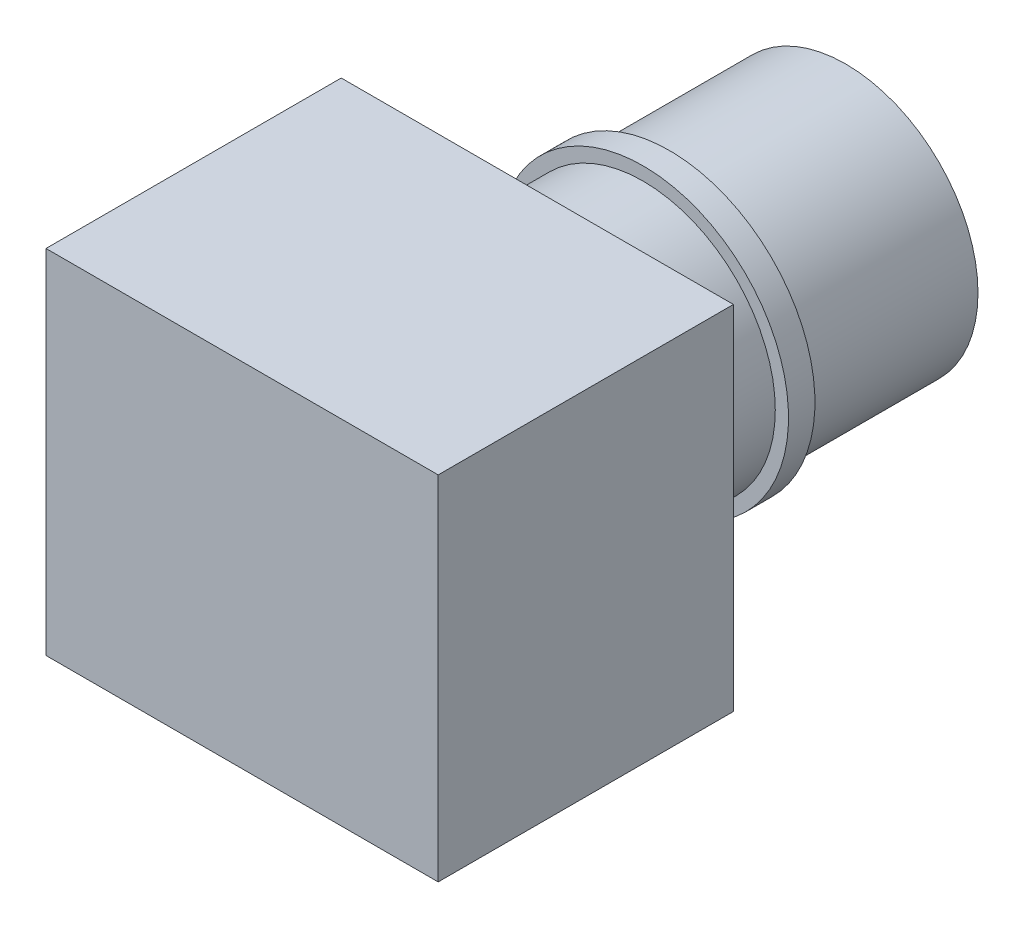
ISO-10303-21;
HEADER;
FILE_DESCRIPTION(('STEP AP214'),'2;1');
FILE_NAME('part.step','',(''),(''),'','','');
FILE_SCHEMA(('AUTOMOTIVE_DESIGN { 1 0 10303 214 1 1 1 1 }'));
ENDSEC;
DATA;
#1=APPLICATION_CONTEXT('core data for automotive mechanical design processes');
#2=APPLICATION_PROTOCOL_DEFINITION('international standard','automotive_design',2000,#1);
#3=PRODUCT_CONTEXT('',#1,'mechanical');
#4=PRODUCT('Part','Part','',(#3));
#5=PRODUCT_RELATED_PRODUCT_CATEGORY('part','',(#4));
#6=PRODUCT_DEFINITION_FORMATION('','',#4);
#7=PRODUCT_DEFINITION_CONTEXT('part definition',#1,'design');
#8=PRODUCT_DEFINITION('design','',#6,#7);
#9=PRODUCT_DEFINITION_SHAPE('','',#8);
#10=(LENGTH_UNIT() NAMED_UNIT(*) SI_UNIT(.MILLI.,.METRE.));
#11=(NAMED_UNIT(*) PLANE_ANGLE_UNIT() SI_UNIT($,.RADIAN.));
#12=(NAMED_UNIT(*) SI_UNIT($,.STERADIAN.) SOLID_ANGLE_UNIT());
#13=UNCERTAINTY_MEASURE_WITH_UNIT(LENGTH_MEASURE(1.E-05),#10,'distance_accuracy_value','');
#14=(GEOMETRIC_REPRESENTATION_CONTEXT(3) GLOBAL_UNCERTAINTY_ASSIGNED_CONTEXT((#13)) GLOBAL_UNIT_ASSIGNED_CONTEXT((#10,
#11,#12)) REPRESENTATION_CONTEXT('',''));
#15=CARTESIAN_POINT('',(0.,0.,0.));
#16=DIRECTION('',(0.,0.,1.));
#17=DIRECTION('',(1.,0.,0.));
#18=AXIS2_PLACEMENT_3D('',#15,#16,#17);
#19=CARTESIAN_POINT('',(22.25,40.,-16.75));
#20=DIRECTION('',(-1.,0.,0.));
#21=DIRECTION('',(0.,0.,1.));
#22=AXIS2_PLACEMENT_3D('',#19,#20,#21);
#23=PLANE('',#22);
#24=DIRECTION('',(0.,0.,-1.));
#25=VECTOR('',#24,1.);
#26=CARTESIAN_POINT('',(22.25,0.,-16.75));
#27=LINE('',#26,#25);
#28=CARTESIAN_POINT('',(22.25,0.,16.75));
#29=VERTEX_POINT('',#28);
#30=CARTESIAN_POINT('',(22.25,0.,-16.75));
#31=VERTEX_POINT('',#30);
#32=EDGE_CURVE('E105',#29,#31,#27,.T.);
#33=ORIENTED_EDGE('',*,*,#32,.T.);
#34=DIRECTION('',(0.,-1.,0.));
#35=VECTOR('',#34,1.);
#36=CARTESIAN_POINT('',(22.25,40.,-16.75));
#37=LINE('',#36,#35);
#38=CARTESIAN_POINT('',(22.25,40.,-16.75));
#39=VERTEX_POINT('',#38);
#40=EDGE_CURVE('E41',#39,#31,#37,.T.);
#41=ORIENTED_EDGE('',*,*,#40,.F.);
#42=DIRECTION('',(0.,0.,-1.));
#43=VECTOR('',#42,1.);
#44=CARTESIAN_POINT('',(22.25,40.,-16.75));
#45=LINE('',#44,#43);
#46=CARTESIAN_POINT('',(22.25,40.,16.75));
#47=VERTEX_POINT('',#46);
#48=EDGE_CURVE('E92',#47,#39,#45,.T.);
#49=ORIENTED_EDGE('',*,*,#48,.F.);
#50=DIRECTION('',(0.,-1.,0.));
#51=VECTOR('',#50,1.);
#52=CARTESIAN_POINT('',(22.25,40.,16.75));
#53=LINE('',#52,#51);
#54=EDGE_CURVE('E101',#47,#29,#53,.T.);
#55=ORIENTED_EDGE('',*,*,#54,.T.);
#56=EDGE_LOOP('',(#33,#41,#49,#55));
#57=FACE_BOUND('',#56,.T.);
#58=ADVANCED_FACE('F38',(#57),#23,.F.);
#59=CARTESIAN_POINT('',(-22.25,40.,-16.75));
#60=DIRECTION('',(0.,0.,1.));
#61=DIRECTION('',(1.,0.,0.));
#62=AXIS2_PLACEMENT_3D('',#59,#60,#61);
#63=PLANE('',#62);
#64=CARTESIAN_POINT('',(0.,20.,-16.75));
#65=DIRECTION('',(0.,0.,-1.));
#66=DIRECTION('',(-1.,0.,0.));
#67=AXIS2_PLACEMENT_3D('',#64,#65,#66);
#68=CIRCLE('',#67,15.);
#69=CARTESIAN_POINT('',(-15.,20.,-16.75));
#70=VERTEX_POINT('',#69);
#71=EDGE_CURVE('E47',#70,#70,#68,.T.);
#72=ORIENTED_EDGE('',*,*,#71,.F.);
#73=EDGE_LOOP('',(#72));
#74=FACE_BOUND('',#73,.T.);
#75=DIRECTION('',(-1.,0.,0.));
#76=VECTOR('',#75,1.);
#77=CARTESIAN_POINT('',(-22.25,0.,-16.75));
#78=LINE('',#77,#76);
#79=CARTESIAN_POINT('',(-22.25,0.,-16.75));
#80=VERTEX_POINT('',#79);
#81=EDGE_CURVE('E97',#31,#80,#78,.T.);
#82=ORIENTED_EDGE('',*,*,#81,.T.);
#83=DIRECTION('',(0.,-1.,0.));
#84=VECTOR('',#83,1.);
#85=CARTESIAN_POINT('',(-22.25,40.,-16.75));
#86=LINE('',#85,#84);
#87=CARTESIAN_POINT('',(-22.25,40.,-16.75));
#88=VERTEX_POINT('',#87);
#89=EDGE_CURVE('E95',#88,#80,#86,.T.);
#90=ORIENTED_EDGE('',*,*,#89,.F.);
#91=DIRECTION('',(-1.,0.,0.));
#92=VECTOR('',#91,1.);
#93=CARTESIAN_POINT('',(-22.25,40.,-16.75));
#94=LINE('',#93,#92);
#95=EDGE_CURVE('E87',#39,#88,#94,.T.);
#96=ORIENTED_EDGE('',*,*,#95,.F.);
#97=ORIENTED_EDGE('',*,*,#40,.T.);
#98=EDGE_LOOP('',(#82,#90,#96,#97));
#99=FACE_BOUND('',#98,.T.);
#100=ADVANCED_FACE('F96',(#74,#99),#63,.F.);
#101=CARTESIAN_POINT('',(-22.25,40.,-16.75));
#102=DIRECTION('',(1.,0.,0.));
#103=DIRECTION('',(0.,0.,-1.));
#104=AXIS2_PLACEMENT_3D('',#101,#102,#103);
#105=PLANE('',#104);
#106=DIRECTION('',(0.,0.,1.));
#107=VECTOR('',#106,1.);
#108=CARTESIAN_POINT('',(-22.25,0.,-16.75));
#109=LINE('',#108,#107);
#110=CARTESIAN_POINT('',(-22.25,0.,16.75));
#111=VERTEX_POINT('',#110);
#112=EDGE_CURVE('E73',#80,#111,#109,.T.);
#113=ORIENTED_EDGE('',*,*,#112,.T.);
#114=DIRECTION('',(0.,-1.,0.));
#115=VECTOR('',#114,1.);
#116=CARTESIAN_POINT('',(-22.25,40.,16.75));
#117=LINE('',#116,#115);
#118=CARTESIAN_POINT('',(-22.25,40.,16.75));
#119=VERTEX_POINT('',#118);
#120=EDGE_CURVE('E98',#119,#111,#117,.T.);
#121=ORIENTED_EDGE('',*,*,#120,.F.);
#122=DIRECTION('',(0.,0.,1.));
#123=VECTOR('',#122,1.);
#124=CARTESIAN_POINT('',(-22.25,40.,-16.75));
#125=LINE('',#124,#123);
#126=EDGE_CURVE('E90',#88,#119,#125,.T.);
#127=ORIENTED_EDGE('',*,*,#126,.F.);
#128=ORIENTED_EDGE('',*,*,#89,.T.);
#129=EDGE_LOOP('',(#113,#121,#127,#128));
#130=FACE_BOUND('',#129,.T.);
#131=ADVANCED_FACE('F99',(#130),#105,.F.);
#132=CARTESIAN_POINT('',(-22.25,40.,16.75));
#133=DIRECTION('',(0.,0.,-1.));
#134=DIRECTION('',(-1.,0.,0.));
#135=AXIS2_PLACEMENT_3D('',#132,#133,#134);
#136=PLANE('',#135);
#137=DIRECTION('',(1.,0.,0.));
#138=VECTOR('',#137,1.);
#139=CARTESIAN_POINT('',(-22.25,0.,16.75));
#140=LINE('',#139,#138);
#141=EDGE_CURVE('E79',#111,#29,#140,.T.);
#142=ORIENTED_EDGE('',*,*,#141,.T.);
#143=ORIENTED_EDGE('',*,*,#54,.F.);
#144=DIRECTION('',(1.,0.,0.));
#145=VECTOR('',#144,1.);
#146=CARTESIAN_POINT('',(-22.25,40.,16.75));
#147=LINE('',#146,#145);
#148=EDGE_CURVE('E56',#119,#47,#147,.T.);
#149=ORIENTED_EDGE('',*,*,#148,.F.);
#150=ORIENTED_EDGE('',*,*,#120,.T.);
#151=EDGE_LOOP('',(#142,#143,#149,#150));
#152=FACE_BOUND('',#151,.T.);
#153=ADVANCED_FACE('F113',(#152),#136,.F.);
#154=CARTESIAN_POINT('',(0.,40.,0.));
#155=DIRECTION('',(0.,1.,0.));
#156=DIRECTION('',(0.,0.,1.));
#157=AXIS2_PLACEMENT_3D('',#154,#155,#156);
#158=PLANE('',#157);
#159=ORIENTED_EDGE('',*,*,#48,.T.);
#160=ORIENTED_EDGE('',*,*,#95,.T.);
#161=ORIENTED_EDGE('',*,*,#126,.T.);
#162=ORIENTED_EDGE('',*,*,#148,.T.);
#163=EDGE_LOOP('',(#159,#160,#161,#162));
#164=FACE_BOUND('',#163,.T.);
#165=ADVANCED_FACE('F88',(#164),#158,.T.);
#166=CARTESIAN_POINT('',(0.,0.,0.));
#167=DIRECTION('',(0.,1.,0.));
#168=DIRECTION('',(0.,0.,1.));
#169=AXIS2_PLACEMENT_3D('',#166,#167,#168);
#170=PLANE('',#169);
#171=ORIENTED_EDGE('',*,*,#32,.F.);
#172=ORIENTED_EDGE('',*,*,#141,.F.);
#173=ORIENTED_EDGE('',*,*,#112,.F.);
#174=ORIENTED_EDGE('',*,*,#81,.F.);
#175=EDGE_LOOP('',(#171,#172,#173,#174));
#176=FACE_BOUND('',#175,.T.);
#177=ADVANCED_FACE('F116',(#176),#170,.F.);
#178=CARTESIAN_POINT('',(0.,20.,-28.75));
#179=DIRECTION('',(0.,0.,1.));
#180=DIRECTION('',(1.,0.,0.));
#181=AXIS2_PLACEMENT_3D('',#178,#179,#180);
#182=CYLINDRICAL_SURFACE('',#181,15.);
#183=CARTESIAN_POINT('',(0.,20.,-28.75));
#184=DIRECTION('',(0.,0.,-1.));
#185=DIRECTION('',(-1.,0.,0.));
#186=AXIS2_PLACEMENT_3D('',#183,#184,#185);
#187=CIRCLE('',#186,15.);
#188=CARTESIAN_POINT('',(-15.,20.,-28.75));
#189=VERTEX_POINT('',#188);
#190=EDGE_CURVE('E108',#189,#189,#187,.T.);
#191=ORIENTED_EDGE('',*,*,#190,.F.);
#192=EDGE_LOOP('',(#191));
#193=FACE_BOUND('',#192,.T.);
#194=ORIENTED_EDGE('',*,*,#71,.T.);
#195=EDGE_LOOP('',(#194));
#196=FACE_BOUND('',#195,.T.);
#197=ADVANCED_FACE('F151',(#193,#196),#182,.T.);
#198=CARTESIAN_POINT('',(0.,20.,-31.75));
#199=DIRECTION('',(0.,0.,1.));
#200=DIRECTION('',(1.,0.,0.));
#201=AXIS2_PLACEMENT_3D('',#198,#199,#200);
#202=CYLINDRICAL_SURFACE('',#201,16.5);
#203=CARTESIAN_POINT('',(0.,20.,-31.75));
#204=DIRECTION('',(0.,0.,-1.));
#205=DIRECTION('',(-1.,0.,0.));
#206=AXIS2_PLACEMENT_3D('',#203,#204,#205);
#207=CIRCLE('',#206,16.5);
#208=CARTESIAN_POINT('',(-16.5,20.,-31.75));
#209=VERTEX_POINT('',#208);
#210=EDGE_CURVE('E123',#209,#209,#207,.T.);
#211=ORIENTED_EDGE('',*,*,#210,.F.);
#212=EDGE_LOOP('',(#211));
#213=FACE_BOUND('',#212,.T.);
#214=CARTESIAN_POINT('',(0.,20.,-28.75));
#215=DIRECTION('',(0.,0.,-1.));
#216=DIRECTION('',(-1.,0.,0.));
#217=AXIS2_PLACEMENT_3D('',#214,#215,#216);
#218=CIRCLE('',#217,16.5);
#219=CARTESIAN_POINT('',(-16.5,20.,-28.75));
#220=VERTEX_POINT('',#219);
#221=EDGE_CURVE('E124',#220,#220,#218,.T.);
#222=ORIENTED_EDGE('',*,*,#221,.T.);
#223=EDGE_LOOP('',(#222));
#224=FACE_BOUND('',#223,.T.);
#225=ADVANCED_FACE('F145',(#213,#224),#202,.T.);
#226=CARTESIAN_POINT('',(0.,20.,-31.75));
#227=DIRECTION('',(0.,0.,-1.));
#228=DIRECTION('',(-1.,0.,0.));
#229=AXIS2_PLACEMENT_3D('',#226,#227,#228);
#230=PLANE('',#229);
#231=CARTESIAN_POINT('',(0.,20.,-31.75));
#232=DIRECTION('',(0.,0.,-1.));
#233=DIRECTION('',(-1.,0.,0.));
#234=AXIS2_PLACEMENT_3D('',#231,#232,#233);
#235=CIRCLE('',#234,15.);
#236=CARTESIAN_POINT('',(-15.,20.,-31.75));
#237=VERTEX_POINT('',#236);
#238=EDGE_CURVE('E11',#237,#237,#235,.T.);
#239=ORIENTED_EDGE('',*,*,#238,.F.);
#240=EDGE_LOOP('',(#239));
#241=FACE_BOUND('',#240,.T.);
#242=ORIENTED_EDGE('',*,*,#210,.T.);
#243=EDGE_LOOP('',(#242));
#244=FACE_BOUND('',#243,.T.);
#245=ADVANCED_FACE('F142',(#241,#244),#230,.T.);
#246=CARTESIAN_POINT('',(0.,20.,-28.75));
#247=DIRECTION('',(0.,0.,-1.));
#248=DIRECTION('',(-1.,0.,0.));
#249=AXIS2_PLACEMENT_3D('',#246,#247,#248);
#250=PLANE('',#249);
#251=ORIENTED_EDGE('',*,*,#190,.T.);
#252=EDGE_LOOP('',(#251));
#253=FACE_BOUND('',#252,.T.);
#254=ORIENTED_EDGE('',*,*,#221,.F.);
#255=EDGE_LOOP('',(#254));
#256=FACE_BOUND('',#255,.T.);
#257=ADVANCED_FACE('F138',(#253,#256),#250,.F.);
#258=CARTESIAN_POINT('',(0.,20.,-51.75));
#259=DIRECTION('',(0.,0.,1.));
#260=DIRECTION('',(1.,0.,0.));
#261=AXIS2_PLACEMENT_3D('',#258,#259,#260);
#262=CYLINDRICAL_SURFACE('',#261,15.);
#263=CARTESIAN_POINT('',(0.,20.,-51.75));
#264=DIRECTION('',(0.,0.,-1.));
#265=DIRECTION('',(-1.,0.,0.));
#266=AXIS2_PLACEMENT_3D('',#263,#264,#265);
#267=CIRCLE('',#266,15.);
#268=CARTESIAN_POINT('',(-15.,20.,-51.75));
#269=VERTEX_POINT('',#268);
#270=EDGE_CURVE('E127',#269,#269,#267,.T.);
#271=ORIENTED_EDGE('',*,*,#270,.F.);
#272=EDGE_LOOP('',(#271));
#273=FACE_BOUND('',#272,.T.);
#274=ORIENTED_EDGE('',*,*,#238,.T.);
#275=EDGE_LOOP('',(#274));
#276=FACE_BOUND('',#275,.T.);
#277=ADVANCED_FACE('F135',(#273,#276),#262,.T.);
#278=CARTESIAN_POINT('',(0.,20.,-51.75));
#279=DIRECTION('',(0.,0.,-1.));
#280=DIRECTION('',(-1.,0.,0.));
#281=AXIS2_PLACEMENT_3D('',#278,#279,#280);
#282=PLANE('',#281);
#283=ORIENTED_EDGE('',*,*,#270,.T.);
#284=EDGE_LOOP('',(#283));
#285=FACE_BOUND('',#284,.T.);
#286=ADVANCED_FACE('F133',(#285),#282,.T.);
#287=CLOSED_SHELL('',(#58,#100,#131,#153,#165,#177,#197,#225,#245,#257,#277,#286));
#288=MANIFOLD_SOLID_BREP('B2',#287);
#289=ADVANCED_BREP_SHAPE_REPRESENTATION('',(#18,#288),#14);
#290=SHAPE_DEFINITION_REPRESENTATION(#9,#289);
ENDSEC;
END-ISO-10303-21;
